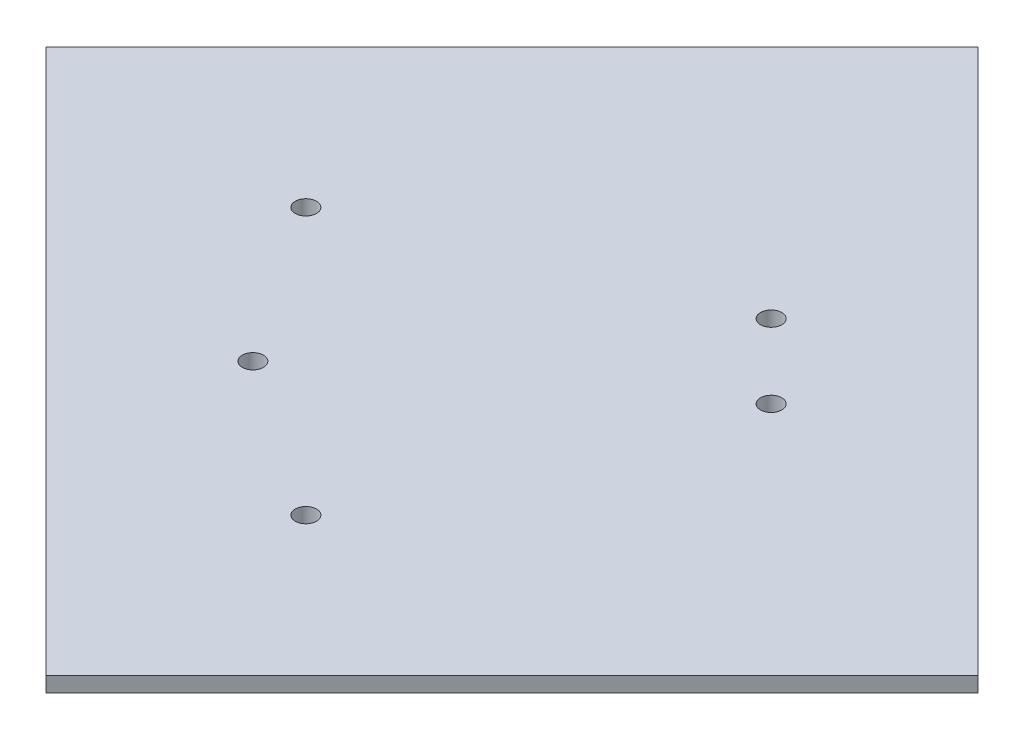
ISO-10303-21;
HEADER;
FILE_DESCRIPTION(('STEP AP214'),'2;1');
FILE_NAME('part.step','',(''),(''),'','','');
FILE_SCHEMA(('AUTOMOTIVE_DESIGN { 1 0 10303 214 1 1 1 1 }'));
ENDSEC;
DATA;
#1=APPLICATION_CONTEXT('core data for automotive mechanical design processes');
#2=APPLICATION_PROTOCOL_DEFINITION('international standard','automotive_design',2000,#1);
#3=PRODUCT_CONTEXT('',#1,'mechanical');
#4=PRODUCT('Part','Part','',(#3));
#5=PRODUCT_RELATED_PRODUCT_CATEGORY('part','',(#4));
#6=PRODUCT_DEFINITION_FORMATION('','',#4);
#7=PRODUCT_DEFINITION_CONTEXT('part definition',#1,'design');
#8=PRODUCT_DEFINITION('design','',#6,#7);
#9=PRODUCT_DEFINITION_SHAPE('','',#8);
#10=(LENGTH_UNIT() NAMED_UNIT(*) SI_UNIT(.MILLI.,.METRE.));
#11=(NAMED_UNIT(*) PLANE_ANGLE_UNIT() SI_UNIT($,.RADIAN.));
#12=(NAMED_UNIT(*) SI_UNIT($,.STERADIAN.) SOLID_ANGLE_UNIT());
#13=UNCERTAINTY_MEASURE_WITH_UNIT(LENGTH_MEASURE(1.E-05),#10,'distance_accuracy_value','');
#14=(GEOMETRIC_REPRESENTATION_CONTEXT(3) GLOBAL_UNCERTAINTY_ASSIGNED_CONTEXT((#13)) GLOBAL_UNIT_ASSIGNED_CONTEXT((#10,
#11,#12)) REPRESENTATION_CONTEXT('',''));
#15=CARTESIAN_POINT('',(0.,0.,0.));
#16=DIRECTION('',(0.,0.,1.));
#17=DIRECTION('',(1.,0.,0.));
#18=AXIS2_PLACEMENT_3D('',#15,#16,#17);
#19=CARTESIAN_POINT('',(-51.0772926901126,3.,-56.7500605505257));
#20=DIRECTION('',(0.,-1.,0.));
#21=DIRECTION('',(0.,0.,-1.));
#22=AXIS2_PLACEMENT_3D('',#19,#20,#21);
#23=PLANE('',#22);
#24=CARTESIAN_POINT('',(-68.9429111656875,3.,68.9429111656892));
#25=DIRECTION('',(0.,1.,0.));
#26=DIRECTION('',(0.,0.,1.));
#27=AXIS2_PLACEMENT_3D('',#24,#25,#26);
#28=CIRCLE('',#27,2.10154583329963);
#29=CARTESIAN_POINT('',(-68.9429111656875,3.,71.0444569989888));
#30=VERTEX_POINT('',#29);
#31=EDGE_CURVE('E131',#30,#30,#28,.T.);
#32=ORIENTED_EDGE('',*,*,#31,.F.);
#33=EDGE_LOOP('',(#32));
#34=FACE_BOUND('',#33,.T.);
#35=CARTESIAN_POINT('',(-10.3324526738592,3.,24.944747377803));
#36=DIRECTION('',(0.,1.,0.));
#37=DIRECTION('',(0.,0.,1.));
#38=AXIS2_PLACEMENT_3D('',#35,#36,#37);
#39=CIRCLE('',#38,2.10154583329844);
#40=CARTESIAN_POINT('',(-10.3324526738592,3.,27.0462932111014));
#41=VERTEX_POINT('',#40);
#42=EDGE_CURVE('E141',#41,#41,#39,.T.);
#43=ORIENTED_EDGE('',*,*,#42,.F.);
#44=EDGE_LOOP('',(#43));
#45=FACE_BOUND('',#44,.T.);
#46=DIRECTION('',(-0.707106781186548,0.,0.707106781186548));
#47=VECTOR('',#46,1.);
#48=CARTESIAN_POINT('',(-71.5522766461503,3.,-36.275076594488));
#49=LINE('',#48,#47);
#50=CARTESIAN_POINT('',(-51.0772926901126,3.,-56.7500605505257));
#51=VERTEX_POINT('',#50);
#52=CARTESIAN_POINT('',(-143.331571742045,3.,35.5042185014069));
#53=VERTEX_POINT('',#52);
#54=EDGE_CURVE('E78',#51,#53,#49,.T.);
#55=ORIENTED_EDGE('',*,*,#54,.T.);
#56=DIRECTION('',(0.707106781186548,0.,0.707106781186547));
#57=VECTOR('',#56,1.);
#58=CARTESIAN_POINT('',(-35.5042185014052,3.,143.331571742047));
#59=LINE('',#58,#57);
#60=CARTESIAN_POINT('',(-35.5042185014052,3.,143.331571742047));
#61=VERTEX_POINT('',#60);
#62=EDGE_CURVE('E81',#53,#61,#59,.T.);
#63=ORIENTED_EDGE('',*,*,#62,.T.);
#64=DIRECTION('',(0.707106781186547,0.,-0.707106781186548));
#65=VECTOR('',#64,1.);
#66=CARTESIAN_POINT('',(36.2750765944897,3.,71.5522766461519));
#67=LINE('',#66,#65);
#68=CARTESIAN_POINT('',(56.7500605505273,3.,51.0772926901142));
#69=VERTEX_POINT('',#68);
#70=EDGE_CURVE('E85',#61,#69,#67,.T.);
#71=ORIENTED_EDGE('',*,*,#70,.T.);
#72=DIRECTION('',(-0.707106781186547,0.,-0.707106781186547));
#73=VECTOR('',#72,1.);
#74=CARTESIAN_POINT('',(-51.0772926901126,3.,-56.7500605505257));
#75=LINE('',#74,#73);
#76=EDGE_CURVE('E50',#69,#51,#75,.T.);
#77=ORIENTED_EDGE('',*,*,#76,.T.);
#78=EDGE_LOOP('',(#55,#63,#71,#77));
#79=FACE_BOUND('',#78,.T.);
#80=CARTESIAN_POINT('',(-24.944747377803,3.,10.3324526738592));
#81=DIRECTION('',(0.,1.,0.));
#82=DIRECTION('',(0.,0.,1.));
#83=AXIS2_PLACEMENT_3D('',#80,#81,#82);
#84=CIRCLE('',#83,2.10154583330077);
#85=CARTESIAN_POINT('',(-24.944747377803,3.,12.4339985071599));
#86=VERTEX_POINT('',#85);
#87=EDGE_CURVE('E99',#86,#86,#84,.T.);
#88=ORIENTED_EDGE('',*,*,#87,.F.);
#89=EDGE_LOOP('',(#88));
#90=FACE_BOUND('',#89,.T.);
#91=CARTESIAN_POINT('',(-90.0782544198483,3.,37.3116346555991));
#92=DIRECTION('',(0.,1.,0.));
#93=DIRECTION('',(0.,0.,1.));
#94=AXIS2_PLACEMENT_3D('',#91,#92,#93);
#95=CIRCLE('',#94,2.10154583330073);
#96=CARTESIAN_POINT('',(-90.0782544198483,3.,39.4131804888998));
#97=VERTEX_POINT('',#96);
#98=EDGE_CURVE('E136',#97,#97,#95,.T.);
#99=ORIENTED_EDGE('',*,*,#98,.F.);
#100=EDGE_LOOP('',(#99));
#101=FACE_BOUND('',#100,.T.);
#102=CARTESIAN_POINT('',(-37.3116346555969,3.,90.0782544198494));
#103=DIRECTION('',(0.,1.,0.));
#104=DIRECTION('',(0.,0.,1.));
#105=AXIS2_PLACEMENT_3D('',#102,#103,#104);
#106=CIRCLE('',#105,2.10154583329829);
#107=CARTESIAN_POINT('',(-37.3116346555969,3.,92.1798002531477));
#108=VERTEX_POINT('',#107);
#109=EDGE_CURVE('E125',#108,#108,#106,.T.);
#110=ORIENTED_EDGE('',*,*,#109,.F.);
#111=EDGE_LOOP('',(#110));
#112=FACE_BOUND('',#111,.T.);
#113=ADVANCED_FACE('F33',(#34,#45,#79,#90,#101,#112),#23,.F.);
#114=CARTESIAN_POINT('',(-51.0772926901126,0.,-56.7500605505257));
#115=DIRECTION('',(0.,-1.,0.));
#116=DIRECTION('',(0.,0.,-1.));
#117=AXIS2_PLACEMENT_3D('',#114,#115,#116);
#118=PLANE('',#117);
#119=CARTESIAN_POINT('',(-68.9429111656875,0.,68.9429111656892));
#120=DIRECTION('',(0.,1.,0.));
#121=DIRECTION('',(0.,0.,1.));
#122=AXIS2_PLACEMENT_3D('',#119,#120,#121);
#123=CIRCLE('',#122,2.10154583329963);
#124=CARTESIAN_POINT('',(-68.9429111656875,0.,71.0444569989888));
#125=VERTEX_POINT('',#124);
#126=EDGE_CURVE('E128',#125,#125,#123,.T.);
#127=ORIENTED_EDGE('',*,*,#126,.T.);
#128=EDGE_LOOP('',(#127));
#129=FACE_BOUND('',#128,.T.);
#130=CARTESIAN_POINT('',(-10.3324526738592,0.,24.944747377803));
#131=DIRECTION('',(0.,1.,0.));
#132=DIRECTION('',(0.,0.,1.));
#133=AXIS2_PLACEMENT_3D('',#130,#131,#132);
#134=CIRCLE('',#133,2.10154583329844);
#135=CARTESIAN_POINT('',(-10.3324526738592,0.,27.0462932111014));
#136=VERTEX_POINT('',#135);
#137=EDGE_CURVE('E139',#136,#136,#134,.T.);
#138=ORIENTED_EDGE('',*,*,#137,.T.);
#139=EDGE_LOOP('',(#138));
#140=FACE_BOUND('',#139,.T.);
#141=DIRECTION('',(-0.707106781186548,0.,0.707106781186547));
#142=VECTOR('',#141,1.);
#143=CARTESIAN_POINT('',(-71.5522766461503,0.,-36.275076594488));
#144=LINE('',#143,#142);
#145=CARTESIAN_POINT('',(-51.0772926901126,0.,-56.7500605505257));
#146=VERTEX_POINT('',#145);
#147=CARTESIAN_POINT('',(-143.331571742045,0.,35.5042185014069));
#148=VERTEX_POINT('',#147);
#149=EDGE_CURVE('E73',#146,#148,#144,.T.);
#150=ORIENTED_EDGE('',*,*,#149,.F.);
#151=DIRECTION('',(-0.707106781186547,0.,-0.707106781186547));
#152=VECTOR('',#151,1.);
#153=CARTESIAN_POINT('',(-51.0772926901126,0.,-56.7500605505257));
#154=LINE('',#153,#152);
#155=CARTESIAN_POINT('',(56.7500605505273,0.,51.0772926901142));
#156=VERTEX_POINT('',#155);
#157=EDGE_CURVE('E102',#156,#146,#154,.T.);
#158=ORIENTED_EDGE('',*,*,#157,.F.);
#159=DIRECTION('',(0.707106781186547,0.,-0.707106781186548));
#160=VECTOR('',#159,1.);
#161=CARTESIAN_POINT('',(36.2750765944897,0.,71.5522766461519));
#162=LINE('',#161,#160);
#163=CARTESIAN_POINT('',(-35.5042185014052,0.,143.331571742047));
#164=VERTEX_POINT('',#163);
#165=EDGE_CURVE('E66',#164,#156,#162,.T.);
#166=ORIENTED_EDGE('',*,*,#165,.F.);
#167=DIRECTION('',(0.707106781186548,0.,0.707106781186547));
#168=VECTOR('',#167,1.);
#169=CARTESIAN_POINT('',(-35.5042185014052,0.,143.331571742047));
#170=LINE('',#169,#168);
#171=EDGE_CURVE('E90',#148,#164,#170,.T.);
#172=ORIENTED_EDGE('',*,*,#171,.F.);
#173=EDGE_LOOP('',(#150,#158,#166,#172));
#174=FACE_BOUND('',#173,.T.);
#175=CARTESIAN_POINT('',(-24.944747377803,0.,10.3324526738592));
#176=DIRECTION('',(0.,1.,0.));
#177=DIRECTION('',(0.,0.,1.));
#178=AXIS2_PLACEMENT_3D('',#175,#176,#177);
#179=CIRCLE('',#178,2.10154583330077);
#180=CARTESIAN_POINT('',(-24.944747377803,0.,12.4339985071599));
#181=VERTEX_POINT('',#180);
#182=EDGE_CURVE('E116',#181,#181,#179,.T.);
#183=ORIENTED_EDGE('',*,*,#182,.T.);
#184=EDGE_LOOP('',(#183));
#185=FACE_BOUND('',#184,.T.);
#186=CARTESIAN_POINT('',(-90.0782544198483,0.,37.3116346555991));
#187=DIRECTION('',(0.,1.,0.));
#188=DIRECTION('',(0.,0.,1.));
#189=AXIS2_PLACEMENT_3D('',#186,#187,#188);
#190=CIRCLE('',#189,2.10154583330073);
#191=CARTESIAN_POINT('',(-90.0782544198483,0.,39.4131804888998));
#192=VERTEX_POINT('',#191);
#193=EDGE_CURVE('E120',#192,#192,#190,.T.);
#194=ORIENTED_EDGE('',*,*,#193,.T.);
#195=EDGE_LOOP('',(#194));
#196=FACE_BOUND('',#195,.T.);
#197=CARTESIAN_POINT('',(-37.3116346555969,0.,90.0782544198494));
#198=DIRECTION('',(0.,1.,0.));
#199=DIRECTION('',(0.,0.,1.));
#200=AXIS2_PLACEMENT_3D('',#197,#198,#199);
#201=CIRCLE('',#200,2.10154583329829);
#202=CARTESIAN_POINT('',(-37.3116346555969,0.,92.1798002531477));
#203=VERTEX_POINT('',#202);
#204=EDGE_CURVE('E123',#203,#203,#201,.T.);
#205=ORIENTED_EDGE('',*,*,#204,.T.);
#206=EDGE_LOOP('',(#205));
#207=FACE_BOUND('',#206,.T.);
#208=ADVANCED_FACE('F108',(#129,#140,#174,#185,#196,#207),#118,.T.);
#209=CARTESIAN_POINT('',(-71.5522766461503,3.,-36.275076594488));
#210=DIRECTION('',(0.707106781186547,0.,0.707106781186548));
#211=DIRECTION('',(0.707106781186548,0.,-0.707106781186547));
#212=AXIS2_PLACEMENT_3D('',#209,#210,#211);
#213=PLANE('',#212);
#214=ORIENTED_EDGE('',*,*,#149,.T.);
#215=DIRECTION('',(0.,-1.,0.));
#216=VECTOR('',#215,1.);
#217=CARTESIAN_POINT('',(-143.331571742045,3.,35.5042185014069));
#218=LINE('',#217,#216);
#219=EDGE_CURVE('E11',#53,#148,#218,.T.);
#220=ORIENTED_EDGE('',*,*,#219,.F.);
#221=ORIENTED_EDGE('',*,*,#54,.F.);
#222=DIRECTION('',(0.,-1.,0.));
#223=VECTOR('',#222,1.);
#224=CARTESIAN_POINT('',(-51.0772926901126,3.,-56.7500605505257));
#225=LINE('',#224,#223);
#226=EDGE_CURVE('E94',#51,#146,#225,.T.);
#227=ORIENTED_EDGE('',*,*,#226,.T.);
#228=EDGE_LOOP('',(#214,#220,#221,#227));
#229=FACE_BOUND('',#228,.T.);
#230=ADVANCED_FACE('F35',(#229),#213,.F.);
#231=CARTESIAN_POINT('',(-35.5042185014052,3.,143.331571742047));
#232=DIRECTION('',(0.707106781186547,0.,-0.707106781186548));
#233=DIRECTION('',(-0.707106781186548,0.,-0.707106781186547));
#234=AXIS2_PLACEMENT_3D('',#231,#232,#233);
#235=PLANE('',#234);
#236=ORIENTED_EDGE('',*,*,#171,.T.);
#237=DIRECTION('',(0.,-1.,0.));
#238=VECTOR('',#237,1.);
#239=CARTESIAN_POINT('',(-35.5042185014052,3.,143.331571742047));
#240=LINE('',#239,#238);
#241=EDGE_CURVE('E42',#61,#164,#240,.T.);
#242=ORIENTED_EDGE('',*,*,#241,.F.);
#243=ORIENTED_EDGE('',*,*,#62,.F.);
#244=ORIENTED_EDGE('',*,*,#219,.T.);
#245=EDGE_LOOP('',(#236,#242,#243,#244));
#246=FACE_BOUND('',#245,.T.);
#247=ADVANCED_FACE('F89',(#246),#235,.F.);
#248=CARTESIAN_POINT('',(36.2750765944897,3.,71.5522766461519));
#249=DIRECTION('',(-0.707106781186548,0.,-0.707106781186547));
#250=DIRECTION('',(-0.707106781186547,0.,0.707106781186548));
#251=AXIS2_PLACEMENT_3D('',#248,#249,#250);
#252=PLANE('',#251);
#253=ORIENTED_EDGE('',*,*,#165,.T.);
#254=DIRECTION('',(0.,-1.,0.));
#255=VECTOR('',#254,1.);
#256=CARTESIAN_POINT('',(56.7500605505273,3.,51.0772926901142));
#257=LINE('',#256,#255);
#258=EDGE_CURVE('E91',#69,#156,#257,.T.);
#259=ORIENTED_EDGE('',*,*,#258,.F.);
#260=ORIENTED_EDGE('',*,*,#70,.F.);
#261=ORIENTED_EDGE('',*,*,#241,.T.);
#262=EDGE_LOOP('',(#253,#259,#260,#261));
#263=FACE_BOUND('',#262,.T.);
#264=ADVANCED_FACE('F92',(#263),#252,.F.);
#265=CARTESIAN_POINT('',(-51.0772926901126,3.,-56.7500605505257));
#266=DIRECTION('',(-0.707106781186548,0.,0.707106781186548));
#267=DIRECTION('',(0.707106781186548,0.,0.707106781186548));
#268=AXIS2_PLACEMENT_3D('',#265,#266,#267);
#269=PLANE('',#268);
#270=ORIENTED_EDGE('',*,*,#157,.T.);
#271=ORIENTED_EDGE('',*,*,#226,.F.);
#272=ORIENTED_EDGE('',*,*,#76,.F.);
#273=ORIENTED_EDGE('',*,*,#258,.T.);
#274=EDGE_LOOP('',(#270,#271,#272,#273));
#275=FACE_BOUND('',#274,.T.);
#276=ADVANCED_FACE('F107',(#275),#269,.F.);
#277=CARTESIAN_POINT('',(-24.944747377803,3.,10.3324526738592));
#278=DIRECTION('',(0.,-1.,0.));
#279=DIRECTION('',(0.,0.,-1.));
#280=AXIS2_PLACEMENT_3D('',#277,#278,#279);
#281=CYLINDRICAL_SURFACE('',#280,2.10154583330077);
#282=ORIENTED_EDGE('',*,*,#87,.T.);
#283=EDGE_LOOP('',(#282));
#284=FACE_BOUND('',#283,.T.);
#285=ORIENTED_EDGE('',*,*,#182,.F.);
#286=EDGE_LOOP('',(#285));
#287=FACE_BOUND('',#286,.T.);
#288=ADVANCED_FACE('F150',(#284,#287),#281,.F.);
#289=CARTESIAN_POINT('',(-10.3324526738592,3.,24.944747377803));
#290=DIRECTION('',(0.,-1.,0.));
#291=DIRECTION('',(0.,0.,-1.));
#292=AXIS2_PLACEMENT_3D('',#289,#290,#291);
#293=CYLINDRICAL_SURFACE('',#292,2.10154583329844);
#294=ORIENTED_EDGE('',*,*,#42,.T.);
#295=EDGE_LOOP('',(#294));
#296=FACE_BOUND('',#295,.T.);
#297=ORIENTED_EDGE('',*,*,#137,.F.);
#298=EDGE_LOOP('',(#297));
#299=FACE_BOUND('',#298,.T.);
#300=ADVANCED_FACE('F173',(#296,#299),#293,.F.);
#301=CARTESIAN_POINT('',(-90.0782544198483,3.,37.3116346555991));
#302=DIRECTION('',(0.,-1.,0.));
#303=DIRECTION('',(0.,0.,-1.));
#304=AXIS2_PLACEMENT_3D('',#301,#302,#303);
#305=CYLINDRICAL_SURFACE('',#304,2.10154583330073);
#306=ORIENTED_EDGE('',*,*,#98,.T.);
#307=EDGE_LOOP('',(#306));
#308=FACE_BOUND('',#307,.T.);
#309=ORIENTED_EDGE('',*,*,#193,.F.);
#310=EDGE_LOOP('',(#309));
#311=FACE_BOUND('',#310,.T.);
#312=ADVANCED_FACE('F167',(#308,#311),#305,.F.);
#313=CARTESIAN_POINT('',(-68.9429111656875,3.,68.9429111656892));
#314=DIRECTION('',(0.,-1.,0.));
#315=DIRECTION('',(0.,0.,-1.));
#316=AXIS2_PLACEMENT_3D('',#313,#314,#315);
#317=CYLINDRICAL_SURFACE('',#316,2.10154583329963);
#318=ORIENTED_EDGE('',*,*,#31,.T.);
#319=EDGE_LOOP('',(#318));
#320=FACE_BOUND('',#319,.T.);
#321=ORIENTED_EDGE('',*,*,#126,.F.);
#322=EDGE_LOOP('',(#321));
#323=FACE_BOUND('',#322,.T.);
#324=ADVANCED_FACE('F162',(#320,#323),#317,.F.);
#325=CARTESIAN_POINT('',(-37.3116346555969,3.,90.0782544198494));
#326=DIRECTION('',(0.,-1.,0.));
#327=DIRECTION('',(0.,0.,-1.));
#328=AXIS2_PLACEMENT_3D('',#325,#326,#327);
#329=CYLINDRICAL_SURFACE('',#328,2.10154583329829);
#330=ORIENTED_EDGE('',*,*,#109,.T.);
#331=EDGE_LOOP('',(#330));
#332=FACE_BOUND('',#331,.T.);
#333=ORIENTED_EDGE('',*,*,#204,.F.);
#334=EDGE_LOOP('',(#333));
#335=FACE_BOUND('',#334,.T.);
#336=ADVANCED_FACE('F160',(#332,#335),#329,.F.);
#337=CLOSED_SHELL('',(#113,#208,#230,#247,#264,#276,#288,#300,#312,#324,#336));
#338=MANIFOLD_SOLID_BREP('B2',#337);
#339=ADVANCED_BREP_SHAPE_REPRESENTATION('',(#18,#338),#14);
#340=SHAPE_DEFINITION_REPRESENTATION(#9,#339);
ENDSEC;
END-ISO-10303-21;
